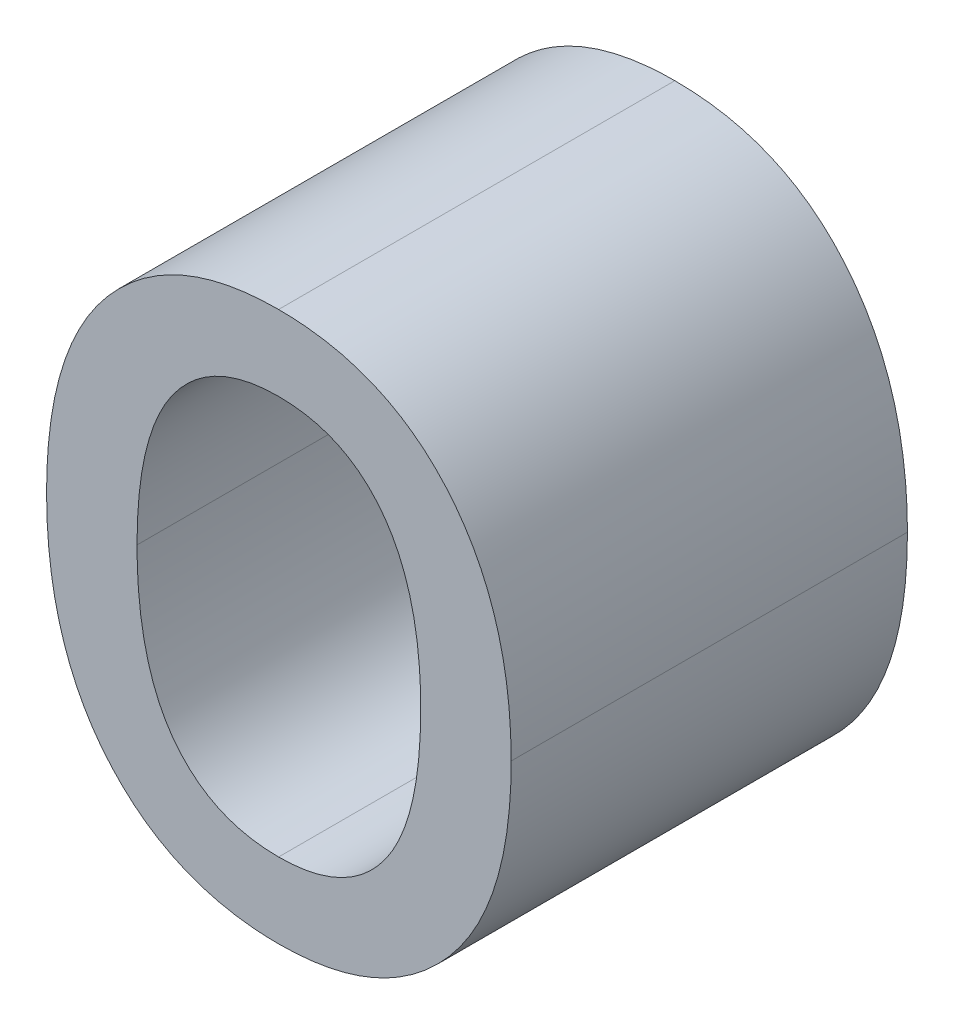
ISO-10303-21;
HEADER;
FILE_DESCRIPTION(('STEP AP214'),'2;1');
FILE_NAME('part.step','',(''),(''),'','','');
FILE_SCHEMA(('AUTOMOTIVE_DESIGN { 1 0 10303 214 1 1 1 1 }'));
ENDSEC;
DATA;
#1=APPLICATION_CONTEXT('core data for automotive mechanical design processes');
#2=APPLICATION_PROTOCOL_DEFINITION('international standard','automotive_design',2000,#1);
#3=PRODUCT_CONTEXT('',#1,'mechanical');
#4=PRODUCT('Part','Part','',(#3));
#5=PRODUCT_RELATED_PRODUCT_CATEGORY('part','',(#4));
#6=PRODUCT_DEFINITION_FORMATION('','',#4);
#7=PRODUCT_DEFINITION_CONTEXT('part definition',#1,'design');
#8=PRODUCT_DEFINITION('design','',#6,#7);
#9=PRODUCT_DEFINITION_SHAPE('','',#8);
#10=(LENGTH_UNIT() NAMED_UNIT(*) SI_UNIT(.MILLI.,.METRE.));
#11=(NAMED_UNIT(*) PLANE_ANGLE_UNIT() SI_UNIT($,.RADIAN.));
#12=(NAMED_UNIT(*) SI_UNIT($,.STERADIAN.) SOLID_ANGLE_UNIT());
#13=UNCERTAINTY_MEASURE_WITH_UNIT(LENGTH_MEASURE(1.E-05),#10,'distance_accuracy_value','');
#14=(GEOMETRIC_REPRESENTATION_CONTEXT(3) GLOBAL_UNCERTAINTY_ASSIGNED_CONTEXT((#13)) GLOBAL_UNIT_ASSIGNED_CONTEXT((#10,
#11,#12)) REPRESENTATION_CONTEXT('',''));
#15=CARTESIAN_POINT('',(0.,0.,0.));
#16=DIRECTION('',(0.,0.,1.));
#17=DIRECTION('',(1.,0.,0.));
#18=AXIS2_PLACEMENT_3D('',#15,#16,#17);
#19=CARTESIAN_POINT('',(6.4278592700702,1.6388248949397,0.));
#20=CARTESIAN_POINT('',(6.4278592700702,1.6388248949397,0.1));
#21=CARTESIAN_POINT('',(6.4108453307101,1.6388248949397,0.));
#22=CARTESIAN_POINT('',(6.4108453307101,1.6388248949397,0.1));
#23=CARTESIAN_POINT('',(6.3921299974139,1.6137293343835,0.));
#24=CARTESIAN_POINT('',(6.3921299974139,1.6137293343835,0.1));
#25=CARTESIAN_POINT('',(6.3921299974139,1.5884919909993,0.));
#26=CARTESIAN_POINT('',(6.3921299974139,1.5884919909993,0.1));
#27=B_SPLINE_SURFACE_WITH_KNOTS('',2,1,((#19,#20),(#21,#22),(#23,#24),(#25,#26)),.UNSPECIFIED.,
.F.,.F.,.F.,(3,1,3),(2,2),(0.,1.,2.),(0.,0.01),.UNSPECIFIED.);
#28=CARTESIAN_POINT('',(6.4278592700702,1.6388248949397,0.));
#29=CARTESIAN_POINT('',(6.4108453307101,1.6388248949397,0.));
#30=CARTESIAN_POINT('',(6.3921299974139,1.6137293343835,0.));
#31=CARTESIAN_POINT('',(6.3921299974139,1.5884919909993,0.));
#32=B_SPLINE_CURVE_WITH_KNOTS('',2,(#28,#29,#30,#31),.UNSPECIFIED.,.F.,.F.,(3,1,3),(0.,1.,2.),.UNSPECIFIED.);
#33=CARTESIAN_POINT('',(6.4278592700702,1.6388248949397,0.));
#34=VERTEX_POINT('',#33);
#35=CARTESIAN_POINT('',(6.3921299974139,1.5884919909993,0.));
#36=VERTEX_POINT('',#35);
#37=EDGE_CURVE('E11',#34,#36,#32,.T.);
#38=DIRECTION('',(0.,0.,1.));
#39=VECTOR('',#38,1.);
#40=CARTESIAN_POINT('',(6.4278592700702,1.6388248949397,0.));
#41=LINE('',#40,#39);
#42=CARTESIAN_POINT('',(6.4278592700702,1.6388248949397,0.1));
#43=VERTEX_POINT('',#42);
#44=EDGE_CURVE('E28',#34,#43,#41,.T.);
#45=CARTESIAN_POINT('',(6.3921299974139,1.5884919909993,0.1));
#46=CARTESIAN_POINT('',(6.3921299974139,1.6137293343835,0.1));
#47=CARTESIAN_POINT('',(6.4108453307101,1.6388248949397,0.1));
#48=CARTESIAN_POINT('',(6.4278592700702,1.6388248949397,0.1));
#49=B_SPLINE_CURVE_WITH_KNOTS('',2,(#45,#46,#47,#48),.UNSPECIFIED.,.F.,.F.,(3,1,3),(-2.,-1.,0.),.UNSPECIFIED.);
#50=CARTESIAN_POINT('',(6.3921299974139,1.5884919909993,0.1));
#51=VERTEX_POINT('',#50);
#52=EDGE_CURVE('E221',#51,#43,#49,.T.);
#53=DIRECTION('',(0.,0.,1.));
#54=VECTOR('',#53,1.);
#55=CARTESIAN_POINT('',(6.3921299974139,1.5884919909993,0.));
#56=LINE('',#55,#54);
#57=EDGE_CURVE('E41',#36,#51,#56,.T.);
#58=ORIENTED_EDGE('',*,*,#37,.F.);
#59=ORIENTED_EDGE('',*,*,#44,.T.);
#60=ORIENTED_EDGE('',*,*,#52,.F.);
#61=ORIENTED_EDGE('',*,*,#57,.F.);
#62=EDGE_LOOP('',(#58,#59,#60,#61));
#63=FACE_BOUND('',#62,.T.);
#64=ADVANCED_FACE('F17',(#63),#27,.F.);
#65=CARTESIAN_POINT('',(6.4637303255546,1.5884919909993,0.));
#66=CARTESIAN_POINT('',(6.4637303255546,1.5884919909993,0.1));
#67=CARTESIAN_POINT('',(6.4637303255546,1.6133039858995,0.));
#68=CARTESIAN_POINT('',(6.4637303255546,1.6133039858995,0.1));
#69=CARTESIAN_POINT('',(6.4450149922584,1.6388248949397,0.));
#70=CARTESIAN_POINT('',(6.4450149922584,1.6388248949397,0.1));
#71=CARTESIAN_POINT('',(6.4278592700702,1.6388248949397,0.));
#72=CARTESIAN_POINT('',(6.4278592700702,1.6388248949397,0.1));
#73=B_SPLINE_SURFACE_WITH_KNOTS('',2,1,((#65,#66),(#67,#68),(#69,#70),(#71,#72)),.UNSPECIFIED.,
.F.,.F.,.F.,(3,1,3),(2,2),(0.,1.,2.),(0.,0.01),.UNSPECIFIED.);
#74=CARTESIAN_POINT('',(6.4637303255546,1.5884919909993,0.));
#75=CARTESIAN_POINT('',(6.4637303255546,1.6133039858995,0.));
#76=CARTESIAN_POINT('',(6.4450149922584,1.6388248949397,0.));
#77=CARTESIAN_POINT('',(6.4278592700702,1.6388248949397,0.));
#78=B_SPLINE_CURVE_WITH_KNOTS('',2,(#74,#75,#76,#77),.UNSPECIFIED.,.F.,.F.,(3,1,3),(0.,1.,2.),.UNSPECIFIED.);
#79=CARTESIAN_POINT('',(6.4637303255546,1.5884919909993,0.));
#80=VERTEX_POINT('',#79);
#81=EDGE_CURVE('E212',#80,#34,#78,.T.);
#82=DIRECTION('',(0.,0.,1.));
#83=VECTOR('',#82,1.);
#84=CARTESIAN_POINT('',(6.4637303255546,1.5884919909993,0.));
#85=LINE('',#84,#83);
#86=CARTESIAN_POINT('',(6.4637303255546,1.5884919909993,0.1));
#87=VERTEX_POINT('',#86);
#88=EDGE_CURVE('E206',#80,#87,#85,.T.);
#89=CARTESIAN_POINT('',(6.4278592700702,1.6388248949397,0.1));
#90=CARTESIAN_POINT('',(6.4450149922584,1.6388248949397,0.1));
#91=CARTESIAN_POINT('',(6.4637303255546,1.6133039858995,0.1));
#92=CARTESIAN_POINT('',(6.4637303255546,1.5884919909993,0.1));
#93=B_SPLINE_CURVE_WITH_KNOTS('',2,(#89,#90,#91,#92),.UNSPECIFIED.,.F.,.F.,(3,1,3),(-2.,-1.,0.),.UNSPECIFIED.);
#94=EDGE_CURVE('E199',#43,#87,#93,.T.);
#95=ORIENTED_EDGE('',*,*,#81,.F.);
#96=ORIENTED_EDGE('',*,*,#88,.T.);
#97=ORIENTED_EDGE('',*,*,#94,.F.);
#98=ORIENTED_EDGE('',*,*,#44,.F.);
#99=EDGE_LOOP('',(#95,#96,#97,#98));
#100=FACE_BOUND('',#99,.T.);
#101=ADVANCED_FACE('F227',(#100),#73,.F.);
#102=CARTESIAN_POINT('',(6.4278592700702,1.5381590870588,0.));
#103=CARTESIAN_POINT('',(6.4278592700702,1.5381590870588,0.1));
#104=CARTESIAN_POINT('',(6.4450149922584,1.5381590870588,0.));
#105=CARTESIAN_POINT('',(6.4450149922584,1.5381590870588,0.1));
#106=CARTESIAN_POINT('',(6.4637303255546,1.562971081959,0.));
#107=CARTESIAN_POINT('',(6.4637303255546,1.562971081959,0.1));
#108=CARTESIAN_POINT('',(6.4637303255546,1.5884919909993,0.));
#109=CARTESIAN_POINT('',(6.4637303255546,1.5884919909993,0.1));
#110=B_SPLINE_SURFACE_WITH_KNOTS('',2,1,((#102,#103),(#104,#105),(#106,#107),(#108,#109)),
.UNSPECIFIED.,.F.,.F.,.F.,(3,1,3),(2,2),(0.,1.,2.),(0.,0.01),.UNSPECIFIED.);
#111=CARTESIAN_POINT('',(6.4278592700702,1.5381590870588,0.));
#112=CARTESIAN_POINT('',(6.4450149922584,1.5381590870588,0.));
#113=CARTESIAN_POINT('',(6.4637303255546,1.562971081959,0.));
#114=CARTESIAN_POINT('',(6.4637303255546,1.5884919909993,0.));
#115=B_SPLINE_CURVE_WITH_KNOTS('',2,(#111,#112,#113,#114),.UNSPECIFIED.,.F.,.F.,(3,1,3),(0.,1.,
2.),.UNSPECIFIED.);
#116=CARTESIAN_POINT('',(6.4278592700702,1.5381590870588,0.));
#117=VERTEX_POINT('',#116);
#118=EDGE_CURVE('E194',#117,#80,#115,.T.);
#119=DIRECTION('',(0.,0.,1.));
#120=VECTOR('',#119,1.);
#121=CARTESIAN_POINT('',(6.4278592700702,1.5381590870588,0.));
#122=LINE('',#121,#120);
#123=CARTESIAN_POINT('',(6.4278592700702,1.5381590870588,0.1));
#124=VERTEX_POINT('',#123);
#125=EDGE_CURVE('E188',#117,#124,#122,.T.);
#126=CARTESIAN_POINT('',(6.4637303255546,1.5884919909993,0.1));
#127=CARTESIAN_POINT('',(6.4637303255546,1.562971081959,0.1));
#128=CARTESIAN_POINT('',(6.4450149922584,1.5381590870588,0.1));
#129=CARTESIAN_POINT('',(6.4278592700702,1.5381590870588,0.1));
#130=B_SPLINE_CURVE_WITH_KNOTS('',2,(#126,#127,#128,#129),.UNSPECIFIED.,.F.,.F.,(3,1,3),(-2.,
-1.,0.),.UNSPECIFIED.);
#131=EDGE_CURVE('E181',#87,#124,#130,.T.);
#132=ORIENTED_EDGE('',*,*,#118,.F.);
#133=ORIENTED_EDGE('',*,*,#125,.T.);
#134=ORIENTED_EDGE('',*,*,#131,.F.);
#135=ORIENTED_EDGE('',*,*,#88,.F.);
#136=EDGE_LOOP('',(#132,#133,#134,#135));
#137=FACE_BOUND('',#136,.T.);
#138=ADVANCED_FACE('F237',(#137),#110,.F.);
#139=CARTESIAN_POINT('',(6.3921299974139,1.5884919909993,0.));
#140=CARTESIAN_POINT('',(6.3921299974139,1.5884919909993,0.1));
#141=CARTESIAN_POINT('',(6.3921299974139,1.562971081959,0.));
#142=CARTESIAN_POINT('',(6.3921299974139,1.562971081959,0.1));
#143=CARTESIAN_POINT('',(6.4107035478821,1.5381590870588,0.));
#144=CARTESIAN_POINT('',(6.4107035478821,1.5381590870588,0.1));
#145=CARTESIAN_POINT('',(6.4278592700702,1.5381590870588,0.));
#146=CARTESIAN_POINT('',(6.4278592700702,1.5381590870588,0.1));
#147=B_SPLINE_SURFACE_WITH_KNOTS('',2,1,((#139,#140),(#141,#142),(#143,#144),(#145,#146)),
.UNSPECIFIED.,.F.,.F.,.F.,(3,1,3),(2,2),(0.,1.,2.),(0.,0.01),.UNSPECIFIED.);
#148=CARTESIAN_POINT('',(6.3921299974139,1.5884919909993,0.));
#149=CARTESIAN_POINT('',(6.3921299974139,1.562971081959,0.));
#150=CARTESIAN_POINT('',(6.4107035478821,1.5381590870588,0.));
#151=CARTESIAN_POINT('',(6.4278592700702,1.5381590870588,0.));
#152=B_SPLINE_CURVE_WITH_KNOTS('',2,(#148,#149,#150,#151),.UNSPECIFIED.,.F.,.F.,(3,1,3),(0.,1.,
2.),.UNSPECIFIED.);
#153=EDGE_CURVE('E173',#36,#117,#152,.T.);
#154=CARTESIAN_POINT('',(6.4278592700702,1.5381590870588,0.1));
#155=CARTESIAN_POINT('',(6.4107035478821,1.5381590870588,0.1));
#156=CARTESIAN_POINT('',(6.3921299974139,1.562971081959,0.1));
#157=CARTESIAN_POINT('',(6.3921299974139,1.5884919909993,0.1));
#158=B_SPLINE_CURVE_WITH_KNOTS('',2,(#154,#155,#156,#157),.UNSPECIFIED.,.F.,.F.,(3,1,3),(-2.,
-1.,0.),.UNSPECIFIED.);
#159=EDGE_CURVE('E165',#124,#51,#158,.T.);
#160=ORIENTED_EDGE('',*,*,#153,.F.);
#161=ORIENTED_EDGE('',*,*,#57,.T.);
#162=ORIENTED_EDGE('',*,*,#159,.F.);
#163=ORIENTED_EDGE('',*,*,#125,.F.);
#164=EDGE_LOOP('',(#160,#161,#162,#163));
#165=FACE_BOUND('',#164,.T.);
#166=ADVANCED_FACE('F232',(#165),#147,.F.);
#167=CARTESIAN_POINT('',(6.4865573608628,1.5884919909993,0.));
#168=CARTESIAN_POINT('',(6.4865573608628,1.5884919909993,0.1));
#169=CARTESIAN_POINT('',(6.4865573608628,1.6205349101276,0.));
#170=CARTESIAN_POINT('',(6.4865573608628,1.6205349101276,0.1));
#171=CARTESIAN_POINT('',(6.4552233558745,1.6578237938919,0.));
#172=CARTESIAN_POINT('',(6.4552233558745,1.6578237938919,0.1));
#173=CARTESIAN_POINT('',(6.4278592700702,1.6578237938919,0.));
#174=CARTESIAN_POINT('',(6.4278592700702,1.6578237938919,0.1));
#175=B_SPLINE_SURFACE_WITH_KNOTS('',2,1,((#167,#168),(#169,#170),(#171,#172),(#173,#174)),
.UNSPECIFIED.,.F.,.F.,.F.,(3,1,3),(2,2),(-2.,-1.,0.),(0.,0.01),.UNSPECIFIED.);
#176=CARTESIAN_POINT('',(6.4278592700702,1.6578237938919,0.));
#177=CARTESIAN_POINT('',(6.4552233558745,1.6578237938919,0.));
#178=CARTESIAN_POINT('',(6.4865573608628,1.6205349101276,0.));
#179=CARTESIAN_POINT('',(6.4865573608628,1.5884919909993,0.));
#180=B_SPLINE_CURVE_WITH_KNOTS('',2,(#176,#177,#178,#179),.UNSPECIFIED.,.F.,.F.,(3,1,3),(0.,1.,
2.),.UNSPECIFIED.);
#181=CARTESIAN_POINT('',(6.4278592700702,1.6578237938919,0.));
#182=VERTEX_POINT('',#181);
#183=CARTESIAN_POINT('',(6.4865573608628,1.5884919909993,0.));
#184=VERTEX_POINT('',#183);
#185=EDGE_CURVE('E161',#182,#184,#180,.T.);
#186=DIRECTION('',(0.,0.,1.));
#187=VECTOR('',#186,1.);
#188=CARTESIAN_POINT('',(6.4278592700702,1.6578237938919,0.));
#189=LINE('',#188,#187);
#190=CARTESIAN_POINT('',(6.4278592700702,1.6578237938919,0.1));
#191=VERTEX_POINT('',#190);
#192=EDGE_CURVE('E156',#182,#191,#189,.T.);
#193=CARTESIAN_POINT('',(6.4865573608628,1.5884919909993,0.1));
#194=CARTESIAN_POINT('',(6.4865573608628,1.6205349101276,0.1));
#195=CARTESIAN_POINT('',(6.4552233558745,1.6578237938919,0.1));
#196=CARTESIAN_POINT('',(6.4278592700702,1.6578237938919,0.1));
#197=B_SPLINE_CURVE_WITH_KNOTS('',2,(#193,#194,#195,#196),.UNSPECIFIED.,.F.,.F.,(3,1,3),(-2.,
-1.,0.),.UNSPECIFIED.);
#198=CARTESIAN_POINT('',(6.4865573608628,1.5884919909993,0.1));
#199=VERTEX_POINT('',#198);
#200=EDGE_CURVE('E110',#199,#191,#197,.T.);
#201=DIRECTION('',(0.,0.,1.));
#202=VECTOR('',#201,1.);
#203=CARTESIAN_POINT('',(6.4865573608628,1.5884919909993,0.));
#204=LINE('',#203,#202);
#205=EDGE_CURVE('E147',#184,#199,#204,.T.);
#206=ORIENTED_EDGE('',*,*,#185,.F.);
#207=ORIENTED_EDGE('',*,*,#192,.T.);
#208=ORIENTED_EDGE('',*,*,#200,.F.);
#209=ORIENTED_EDGE('',*,*,#205,.F.);
#210=EDGE_LOOP('',(#206,#207,#208,#209));
#211=FACE_BOUND('',#210,.T.);
#212=ADVANCED_FACE('F245',(#211),#175,.T.);
#213=CARTESIAN_POINT('',(6.4278592700702,1.5191601881066,0.));
#214=CARTESIAN_POINT('',(6.4278592700702,1.5191601881066,0.1));
#215=CARTESIAN_POINT('',(6.4542308760785,1.5191601881066,0.));
#216=CARTESIAN_POINT('',(6.4542308760785,1.5191601881066,0.1));
#217=CARTESIAN_POINT('',(6.4865573608628,1.5555983749029,0.));
#218=CARTESIAN_POINT('',(6.4865573608628,1.5555983749029,0.1));
#219=CARTESIAN_POINT('',(6.4865573608628,1.5884919909993,0.));
#220=CARTESIAN_POINT('',(6.4865573608628,1.5884919909993,0.1));
#221=B_SPLINE_SURFACE_WITH_KNOTS('',2,1,((#213,#214),(#215,#216),(#217,#218),(#219,#220)),
.UNSPECIFIED.,.F.,.F.,.F.,(3,1,3),(2,2),(-2.,-1.,0.),(0.,0.01),.UNSPECIFIED.);
#222=CARTESIAN_POINT('',(6.4865573608628,1.5884919909993,0.));
#223=CARTESIAN_POINT('',(6.4865573608628,1.5555983749029,0.));
#224=CARTESIAN_POINT('',(6.4542308760785,1.5191601881066,0.));
#225=CARTESIAN_POINT('',(6.4278592700702,1.5191601881066,0.));
#226=B_SPLINE_CURVE_WITH_KNOTS('',2,(#222,#223,#224,#225),.UNSPECIFIED.,.F.,.F.,(3,1,3),(0.,1.,
2.),.UNSPECIFIED.);
#227=CARTESIAN_POINT('',(6.4278592700702,1.5191601881066,0.));
#228=VERTEX_POINT('',#227);
#229=EDGE_CURVE('E140',#184,#228,#226,.T.);
#230=CARTESIAN_POINT('',(6.4278592700702,1.5191601881066,0.1));
#231=CARTESIAN_POINT('',(6.4542308760785,1.5191601881066,0.1));
#232=CARTESIAN_POINT('',(6.4865573608628,1.5555983749029,0.1));
#233=CARTESIAN_POINT('',(6.4865573608628,1.5884919909993,0.1));
#234=B_SPLINE_CURVE_WITH_KNOTS('',2,(#230,#231,#232,#233),.UNSPECIFIED.,.F.,.F.,(3,1,3),(-2.,
-1.,0.),.UNSPECIFIED.);
#235=CARTESIAN_POINT('',(6.4278592700702,1.5191601881066,0.1));
#236=VERTEX_POINT('',#235);
#237=EDGE_CURVE('E136',#236,#199,#234,.T.);
#238=DIRECTION('',(0.,0.,1.));
#239=VECTOR('',#238,1.);
#240=CARTESIAN_POINT('',(6.4278592700702,1.5191601881066,0.));
#241=LINE('',#240,#239);
#242=EDGE_CURVE('E93',#228,#236,#241,.T.);
#243=ORIENTED_EDGE('',*,*,#229,.F.);
#244=ORIENTED_EDGE('',*,*,#205,.T.);
#245=ORIENTED_EDGE('',*,*,#237,.F.);
#246=ORIENTED_EDGE('',*,*,#242,.F.);
#247=EDGE_LOOP('',(#243,#244,#245,#246));
#248=FACE_BOUND('',#247,.T.);
#249=ADVANCED_FACE('F280',(#248),#221,.T.);
#250=CARTESIAN_POINT('',(6.3693029621056,1.5884919909993,0.));
#251=CARTESIAN_POINT('',(6.3693029621056,1.5884919909993,0.1));
#252=CARTESIAN_POINT('',(6.3693029621056,1.5554565920749,0.));
#253=CARTESIAN_POINT('',(6.3693029621056,1.5554565920749,0.1));
#254=CARTESIAN_POINT('',(6.401204098406,1.5191601881066,0.));
#255=CARTESIAN_POINT('',(6.401204098406,1.5191601881066,0.1));
#256=CARTESIAN_POINT('',(6.4278592700702,1.5191601881066,0.));
#257=CARTESIAN_POINT('',(6.4278592700702,1.5191601881066,0.1));
#258=B_SPLINE_SURFACE_WITH_KNOTS('',2,1,((#250,#251),(#252,#253),(#254,#255),(#256,#257)),
.UNSPECIFIED.,.F.,.F.,.F.,(3,1,3),(2,2),(-2.,-1.,0.),(0.,0.01),.UNSPECIFIED.);
#259=CARTESIAN_POINT('',(6.4278592700702,1.5191601881066,0.));
#260=CARTESIAN_POINT('',(6.401204098406,1.5191601881066,0.));
#261=CARTESIAN_POINT('',(6.3693029621056,1.5554565920749,0.));
#262=CARTESIAN_POINT('',(6.3693029621056,1.5884919909993,0.));
#263=B_SPLINE_CURVE_WITH_KNOTS('',2,(#259,#260,#261,#262),.UNSPECIFIED.,.F.,.F.,(3,1,3),(0.,1.,
2.),.UNSPECIFIED.);
#264=CARTESIAN_POINT('',(6.3693029621056,1.5884919909993,0.));
#265=VERTEX_POINT('',#264);
#266=EDGE_CURVE('E97',#228,#265,#263,.T.);
#267=CARTESIAN_POINT('',(6.3693029621056,1.5884919909993,0.1));
#268=CARTESIAN_POINT('',(6.3693029621056,1.5554565920749,0.1));
#269=CARTESIAN_POINT('',(6.401204098406,1.5191601881066,0.1));
#270=CARTESIAN_POINT('',(6.4278592700702,1.5191601881066,0.1));
#271=B_SPLINE_CURVE_WITH_KNOTS('',2,(#267,#268,#269,#270),.UNSPECIFIED.,.F.,.F.,(3,1,3),(-2.,
-1.,0.),.UNSPECIFIED.);
#272=CARTESIAN_POINT('',(6.3693029621056,1.5884919909993,0.1));
#273=VERTEX_POINT('',#272);
#274=EDGE_CURVE('E86',#273,#236,#271,.T.);
#275=DIRECTION('',(0.,0.,1.));
#276=VECTOR('',#275,1.);
#277=CARTESIAN_POINT('',(6.3693029621056,1.5884919909993,0.));
#278=LINE('',#277,#276);
#279=EDGE_CURVE('E90',#265,#273,#278,.T.);
#280=ORIENTED_EDGE('',*,*,#266,.F.);
#281=ORIENTED_EDGE('',*,*,#242,.T.);
#282=ORIENTED_EDGE('',*,*,#274,.F.);
#283=ORIENTED_EDGE('',*,*,#279,.F.);
#284=EDGE_LOOP('',(#280,#281,#282,#283));
#285=FACE_BOUND('',#284,.T.);
#286=ADVANCED_FACE('F89',(#285),#258,.T.);
#287=CARTESIAN_POINT('',(6.4278592700702,1.6578237938919,0.));
#288=CARTESIAN_POINT('',(6.4278592700702,1.6578237938919,0.1));
#289=CARTESIAN_POINT('',(6.401204098406,1.6578237938919,0.));
#290=CARTESIAN_POINT('',(6.401204098406,1.6578237938919,0.1));
#291=CARTESIAN_POINT('',(6.3693029621056,1.6216691727516,0.));
#292=CARTESIAN_POINT('',(6.3693029621056,1.6216691727516,0.1));
#293=CARTESIAN_POINT('',(6.3693029621056,1.5884919909993,0.));
#294=CARTESIAN_POINT('',(6.3693029621056,1.5884919909993,0.1));
#295=B_SPLINE_SURFACE_WITH_KNOTS('',2,1,((#287,#288),(#289,#290),(#291,#292),(#293,#294)),
.UNSPECIFIED.,.F.,.F.,.F.,(3,1,3),(2,2),(-2.,-1.,0.),(0.,0.01),.UNSPECIFIED.);
#296=CARTESIAN_POINT('',(6.3693029621056,1.5884919909993,0.));
#297=CARTESIAN_POINT('',(6.3693029621056,1.6216691727516,0.));
#298=CARTESIAN_POINT('',(6.401204098406,1.6578237938919,0.));
#299=CARTESIAN_POINT('',(6.4278592700702,1.6578237938919,0.));
#300=B_SPLINE_CURVE_WITH_KNOTS('',2,(#296,#297,#298,#299),.UNSPECIFIED.,.F.,.F.,(3,1,3),(0.,1.,
2.),.UNSPECIFIED.);
#301=EDGE_CURVE('E105',#265,#182,#300,.T.);
#302=CARTESIAN_POINT('',(6.4278592700702,1.6578237938919,0.1));
#303=CARTESIAN_POINT('',(6.401204098406,1.6578237938919,0.1));
#304=CARTESIAN_POINT('',(6.3693029621056,1.6216691727516,0.1));
#305=CARTESIAN_POINT('',(6.3693029621056,1.5884919909993,0.1));
#306=B_SPLINE_CURVE_WITH_KNOTS('',2,(#302,#303,#304,#305),.UNSPECIFIED.,.F.,.F.,(3,1,3),(-2.,
-1.,0.),.UNSPECIFIED.);
#307=EDGE_CURVE('E103',#191,#273,#306,.T.);
#308=ORIENTED_EDGE('',*,*,#301,.F.);
#309=ORIENTED_EDGE('',*,*,#279,.T.);
#310=ORIENTED_EDGE('',*,*,#307,.F.);
#311=ORIENTED_EDGE('',*,*,#192,.F.);
#312=EDGE_LOOP('',(#308,#309,#310,#311));
#313=FACE_BOUND('',#312,.T.);
#314=ADVANCED_FACE('F101',(#313),#295,.T.);
#315=CARTESIAN_POINT('',(6.4278666115339,1.5885253870288,0.));
#316=DIRECTION('',(0.,0.,1.));
#317=DIRECTION('',(1.,0.,0.));
#318=AXIS2_PLACEMENT_3D('',#315,#316,#317);
#319=PLANE('',#318);
#320=ORIENTED_EDGE('',*,*,#301,.T.);
#321=ORIENTED_EDGE('',*,*,#185,.T.);
#322=ORIENTED_EDGE('',*,*,#229,.T.);
#323=ORIENTED_EDGE('',*,*,#266,.T.);
#324=EDGE_LOOP('',(#320,#321,#322,#323));
#325=FACE_BOUND('',#324,.T.);
#326=ORIENTED_EDGE('',*,*,#37,.T.);
#327=ORIENTED_EDGE('',*,*,#153,.T.);
#328=ORIENTED_EDGE('',*,*,#118,.T.);
#329=ORIENTED_EDGE('',*,*,#81,.T.);
#330=EDGE_LOOP('',(#326,#327,#328,#329));
#331=FACE_BOUND('',#330,.T.);
#332=ADVANCED_FACE('F235',(#325,#331),#319,.F.);
#333=CARTESIAN_POINT('',(6.4278666115339,1.5885253870288,0.1));
#334=DIRECTION('',(0.,0.,1.));
#335=DIRECTION('',(1.,0.,0.));
#336=AXIS2_PLACEMENT_3D('',#333,#334,#335);
#337=PLANE('',#336);
#338=ORIENTED_EDGE('',*,*,#307,.T.);
#339=ORIENTED_EDGE('',*,*,#274,.T.);
#340=ORIENTED_EDGE('',*,*,#237,.T.);
#341=ORIENTED_EDGE('',*,*,#200,.T.);
#342=EDGE_LOOP('',(#338,#339,#340,#341));
#343=FACE_BOUND('',#342,.T.);
#344=ORIENTED_EDGE('',*,*,#52,.T.);
#345=ORIENTED_EDGE('',*,*,#94,.T.);
#346=ORIENTED_EDGE('',*,*,#131,.T.);
#347=ORIENTED_EDGE('',*,*,#159,.T.);
#348=EDGE_LOOP('',(#344,#345,#346,#347));
#349=FACE_BOUND('',#348,.T.);
#350=ADVANCED_FACE('F108',(#343,#349),#337,.T.);
#351=CLOSED_SHELL('',(#64,#101,#138,#166,#212,#249,#286,#314,#332,#350));
#352=MANIFOLD_SOLID_BREP('B1',#351);
#353=ADVANCED_BREP_SHAPE_REPRESENTATION('',(#18,#352),#14);
#354=SHAPE_DEFINITION_REPRESENTATION(#9,#353);
ENDSEC;
END-ISO-10303-21;
